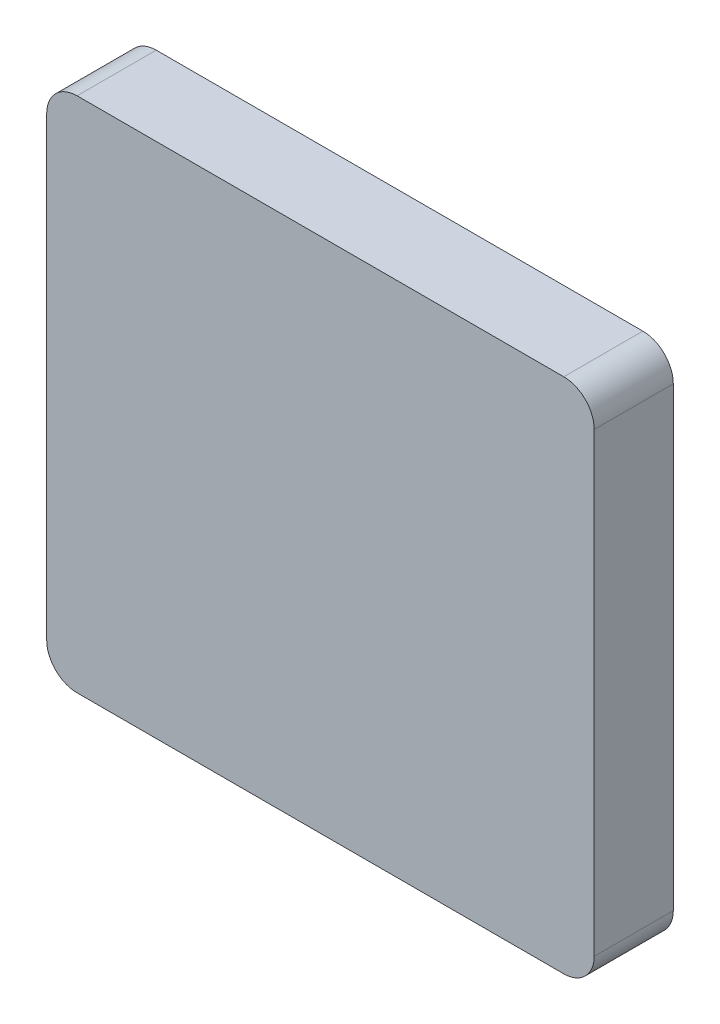
ISO-10303-21;
HEADER;
FILE_DESCRIPTION(('STEP AP214'),'2;1');
FILE_NAME('part.step','',(''),(''),'','','');
FILE_SCHEMA(('AUTOMOTIVE_DESIGN { 1 0 10303 214 1 1 1 1 }'));
ENDSEC;
DATA;
#1=APPLICATION_CONTEXT('core data for automotive mechanical design processes');
#2=APPLICATION_PROTOCOL_DEFINITION('international standard','automotive_design',2000,#1);
#3=PRODUCT_CONTEXT('',#1,'mechanical');
#4=PRODUCT('Part','Part','',(#3));
#5=PRODUCT_RELATED_PRODUCT_CATEGORY('part','',(#4));
#6=PRODUCT_DEFINITION_FORMATION('','',#4);
#7=PRODUCT_DEFINITION_CONTEXT('part definition',#1,'design');
#8=PRODUCT_DEFINITION('design','',#6,#7);
#9=PRODUCT_DEFINITION_SHAPE('','',#8);
#10=(LENGTH_UNIT() NAMED_UNIT(*) SI_UNIT(.MILLI.,.METRE.));
#11=(NAMED_UNIT(*) PLANE_ANGLE_UNIT() SI_UNIT($,.RADIAN.));
#12=(NAMED_UNIT(*) SI_UNIT($,.STERADIAN.) SOLID_ANGLE_UNIT());
#13=UNCERTAINTY_MEASURE_WITH_UNIT(LENGTH_MEASURE(1.E-05),#10,'distance_accuracy_value','');
#14=(GEOMETRIC_REPRESENTATION_CONTEXT(3) GLOBAL_UNCERTAINTY_ASSIGNED_CONTEXT((#13)) GLOBAL_UNIT_ASSIGNED_CONTEXT((#10,
#11,#12)) REPRESENTATION_CONTEXT('',''));
#15=CARTESIAN_POINT('',(0.,0.,0.));
#16=DIRECTION('',(0.,0.,1.));
#17=DIRECTION('',(1.,0.,0.));
#18=AXIS2_PLACEMENT_3D('',#15,#16,#17);
#19=CARTESIAN_POINT('',(-9.,8.5,2.6));
#20=DIRECTION('',(1.,0.,0.));
#21=DIRECTION('',(0.,1.,0.));
#22=AXIS2_PLACEMENT_3D('',#19,#20,#21);
#23=PLANE('',#22);
#24=DIRECTION('',(0.,-1.,0.));
#25=VECTOR('',#24,1.);
#26=CARTESIAN_POINT('',(-9.,8.5,0.));
#27=LINE('',#26,#25);
#28=CARTESIAN_POINT('',(-9.,7.5,0.));
#29=VERTEX_POINT('',#28);
#30=CARTESIAN_POINT('',(-9.,-7.5,0.));
#31=VERTEX_POINT('',#30);
#32=EDGE_CURVE('E131',#29,#31,#27,.T.);
#33=ORIENTED_EDGE('',*,*,#32,.T.);
#34=DIRECTION('',(0.,0.,-1.));
#35=VECTOR('',#34,1.);
#36=CARTESIAN_POINT('',(-9.,-7.5,2.6));
#37=LINE('',#36,#35);
#38=CARTESIAN_POINT('',(-9.,-7.5,2.6));
#39=VERTEX_POINT('',#38);
#40=EDGE_CURVE('E109',#31,#39,#37,.F.);
#41=ORIENTED_EDGE('',*,*,#40,.T.);
#42=DIRECTION('',(0.,-1.,0.));
#43=VECTOR('',#42,1.);
#44=CARTESIAN_POINT('',(-9.,8.5,2.6));
#45=LINE('',#44,#43);
#46=CARTESIAN_POINT('',(-9.,7.5,2.6));
#47=VERTEX_POINT('',#46);
#48=EDGE_CURVE('E143',#47,#39,#45,.T.);
#49=ORIENTED_EDGE('',*,*,#48,.F.);
#50=DIRECTION('',(0.,0.,-1.));
#51=VECTOR('',#50,1.);
#52=CARTESIAN_POINT('',(-9.,7.5,2.6));
#53=LINE('',#52,#51);
#54=EDGE_CURVE('E113',#47,#29,#53,.T.);
#55=ORIENTED_EDGE('',*,*,#54,.T.);
#56=EDGE_LOOP('',(#33,#41,#49,#55));
#57=FACE_BOUND('',#56,.T.);
#58=ADVANCED_FACE('F39',(#57),#23,.F.);
#59=CARTESIAN_POINT('',(9.,-8.5,2.6));
#60=DIRECTION('',(0.,1.,0.));
#61=DIRECTION('',(-1.,0.,0.));
#62=AXIS2_PLACEMENT_3D('',#59,#60,#61);
#63=PLANE('',#62);
#64=DIRECTION('',(1.,0.,0.));
#65=VECTOR('',#64,1.);
#66=CARTESIAN_POINT('',(9.,-8.5,2.6));
#67=LINE('',#66,#65);
#68=CARTESIAN_POINT('',(-8.,-8.5,2.6));
#69=VERTEX_POINT('',#68);
#70=CARTESIAN_POINT('',(8.,-8.5,2.6));
#71=VERTEX_POINT('',#70);
#72=EDGE_CURVE('E122',#69,#71,#67,.T.);
#73=ORIENTED_EDGE('',*,*,#72,.F.);
#74=DIRECTION('',(0.,0.,-1.));
#75=VECTOR('',#74,1.);
#76=CARTESIAN_POINT('',(-8.,-8.5,2.6));
#77=LINE('',#76,#75);
#78=CARTESIAN_POINT('',(-8.,-8.5,0.));
#79=VERTEX_POINT('',#78);
#80=EDGE_CURVE('E108',#69,#79,#77,.T.);
#81=ORIENTED_EDGE('',*,*,#80,.T.);
#82=DIRECTION('',(1.,0.,0.));
#83=VECTOR('',#82,1.);
#84=CARTESIAN_POINT('',(9.,-8.5,0.));
#85=LINE('',#84,#83);
#86=CARTESIAN_POINT('',(8.,-8.5,0.));
#87=VERTEX_POINT('',#86);
#88=EDGE_CURVE('E125',#79,#87,#85,.T.);
#89=ORIENTED_EDGE('',*,*,#88,.T.);
#90=DIRECTION('',(0.,0.,-1.));
#91=VECTOR('',#90,1.);
#92=CARTESIAN_POINT('',(8.,-8.5,2.6));
#93=LINE('',#92,#91);
#94=EDGE_CURVE('E130',#87,#71,#93,.F.);
#95=ORIENTED_EDGE('',*,*,#94,.T.);
#96=EDGE_LOOP('',(#73,#81,#89,#95));
#97=FACE_BOUND('',#96,.T.);
#98=ADVANCED_FACE('F123',(#97),#63,.F.);
#99=CARTESIAN_POINT('',(9.,8.5,2.6));
#100=DIRECTION('',(-1.,0.,0.));
#101=DIRECTION('',(0.,0.,1.));
#102=AXIS2_PLACEMENT_3D('',#99,#100,#101);
#103=PLANE('',#102);
#104=DIRECTION('',(0.,1.,0.));
#105=VECTOR('',#104,1.);
#106=CARTESIAN_POINT('',(9.,8.5,2.6));
#107=LINE('',#106,#105);
#108=CARTESIAN_POINT('',(9.,-7.5,2.6));
#109=VERTEX_POINT('',#108);
#110=CARTESIAN_POINT('',(9.,7.5,2.6));
#111=VERTEX_POINT('',#110);
#112=EDGE_CURVE('E170',#109,#111,#107,.T.);
#113=ORIENTED_EDGE('',*,*,#112,.F.);
#114=DIRECTION('',(0.,0.,-1.));
#115=VECTOR('',#114,1.);
#116=CARTESIAN_POINT('',(9.,-7.5,2.6));
#117=LINE('',#116,#115);
#118=CARTESIAN_POINT('',(9.,-7.5,0.));
#119=VERTEX_POINT('',#118);
#120=EDGE_CURVE('E159',#109,#119,#117,.T.);
#121=ORIENTED_EDGE('',*,*,#120,.T.);
#122=DIRECTION('',(0.,1.,0.));
#123=VECTOR('',#122,1.);
#124=CARTESIAN_POINT('',(9.,8.5,0.));
#125=LINE('',#124,#123);
#126=CARTESIAN_POINT('',(9.,7.5,0.));
#127=VERTEX_POINT('',#126);
#128=EDGE_CURVE('E134',#119,#127,#125,.T.);
#129=ORIENTED_EDGE('',*,*,#128,.T.);
#130=DIRECTION('',(0.,0.,-1.));
#131=VECTOR('',#130,1.);
#132=CARTESIAN_POINT('',(9.,7.5,2.6));
#133=LINE('',#132,#131);
#134=EDGE_CURVE('E158',#127,#111,#133,.F.);
#135=ORIENTED_EDGE('',*,*,#134,.T.);
#136=EDGE_LOOP('',(#113,#121,#129,#135));
#137=FACE_BOUND('',#136,.T.);
#138=ADVANCED_FACE('F164',(#137),#103,.F.);
#139=CARTESIAN_POINT('',(9.,8.5,2.6));
#140=DIRECTION('',(0.,-1.,0.));
#141=DIRECTION('',(1.,0.,0.));
#142=AXIS2_PLACEMENT_3D('',#139,#140,#141);
#143=PLANE('',#142);
#144=DIRECTION('',(-1.,0.,0.));
#145=VECTOR('',#144,1.);
#146=CARTESIAN_POINT('',(9.,8.5,2.6));
#147=LINE('',#146,#145);
#148=CARTESIAN_POINT('',(8.,8.5,2.6));
#149=VERTEX_POINT('',#148);
#150=CARTESIAN_POINT('',(-8.,8.5,2.6));
#151=VERTEX_POINT('',#150);
#152=EDGE_CURVE('E142',#149,#151,#147,.T.);
#153=ORIENTED_EDGE('',*,*,#152,.F.);
#154=DIRECTION('',(0.,0.,-1.));
#155=VECTOR('',#154,1.);
#156=CARTESIAN_POINT('',(8.,8.5,2.6));
#157=LINE('',#156,#155);
#158=CARTESIAN_POINT('',(8.,8.5,0.));
#159=VERTEX_POINT('',#158);
#160=EDGE_CURVE('E11',#149,#159,#157,.T.);
#161=ORIENTED_EDGE('',*,*,#160,.T.);
#162=DIRECTION('',(-1.,0.,0.));
#163=VECTOR('',#162,1.);
#164=CARTESIAN_POINT('',(9.,8.5,0.));
#165=LINE('',#164,#163);
#166=CARTESIAN_POINT('',(-8.,8.5,0.));
#167=VERTEX_POINT('',#166);
#168=EDGE_CURVE('E132',#159,#167,#165,.T.);
#169=ORIENTED_EDGE('',*,*,#168,.T.);
#170=DIRECTION('',(0.,0.,-1.));
#171=VECTOR('',#170,1.);
#172=CARTESIAN_POINT('',(-8.,8.5,2.6));
#173=LINE('',#172,#171);
#174=EDGE_CURVE('E50',#167,#151,#173,.F.);
#175=ORIENTED_EDGE('',*,*,#174,.T.);
#176=EDGE_LOOP('',(#153,#161,#169,#175));
#177=FACE_BOUND('',#176,.T.);
#178=ADVANCED_FACE('F173',(#177),#143,.F.);
#179=CARTESIAN_POINT('',(0.,0.,2.6));
#180=DIRECTION('',(0.,0.,-1.));
#181=DIRECTION('',(-1.,0.,0.));
#182=AXIS2_PLACEMENT_3D('',#179,#180,#181);
#183=PLANE('',#182);
#184=ORIENTED_EDGE('',*,*,#48,.T.);
#185=CARTESIAN_POINT('',(-8.,-7.5,2.6));
#186=DIRECTION('',(0.,0.,-1.));
#187=DIRECTION('',(-1.,0.,0.));
#188=AXIS2_PLACEMENT_3D('',#185,#186,#187);
#189=CIRCLE('',#188,1.);
#190=EDGE_CURVE('E156',#39,#69,#189,.F.);
#191=ORIENTED_EDGE('',*,*,#190,.T.);
#192=ORIENTED_EDGE('',*,*,#72,.T.);
#193=CARTESIAN_POINT('',(8.,-7.5,2.6));
#194=DIRECTION('',(0.,0.,-1.));
#195=DIRECTION('',(-1.,0.,0.));
#196=AXIS2_PLACEMENT_3D('',#193,#194,#195);
#197=CIRCLE('',#196,1.);
#198=EDGE_CURVE('E152',#71,#109,#197,.F.);
#199=ORIENTED_EDGE('',*,*,#198,.T.);
#200=ORIENTED_EDGE('',*,*,#112,.T.);
#201=CARTESIAN_POINT('',(8.,7.5,2.6));
#202=DIRECTION('',(0.,0.,-1.));
#203=DIRECTION('',(-1.,0.,0.));
#204=AXIS2_PLACEMENT_3D('',#201,#202,#203);
#205=CIRCLE('',#204,1.);
#206=EDGE_CURVE('E58',#111,#149,#205,.F.);
#207=ORIENTED_EDGE('',*,*,#206,.T.);
#208=ORIENTED_EDGE('',*,*,#152,.T.);
#209=CARTESIAN_POINT('',(-8.,7.5,2.6));
#210=DIRECTION('',(0.,0.,-1.));
#211=DIRECTION('',(-1.,0.,0.));
#212=AXIS2_PLACEMENT_3D('',#209,#210,#211);
#213=CIRCLE('',#212,1.);
#214=EDGE_CURVE('E151',#151,#47,#213,.F.);
#215=ORIENTED_EDGE('',*,*,#214,.T.);
#216=EDGE_LOOP('',(#184,#191,#192,#199,#200,#207,#208,#215));
#217=FACE_BOUND('',#216,.T.);
#218=ADVANCED_FACE('F182',(#217),#183,.F.);
#219=CARTESIAN_POINT('',(0.,0.,0.));
#220=DIRECTION('',(0.,0.,-1.));
#221=DIRECTION('',(-1.,0.,0.));
#222=AXIS2_PLACEMENT_3D('',#219,#220,#221);
#223=PLANE('',#222);
#224=ORIENTED_EDGE('',*,*,#88,.F.);
#225=CARTESIAN_POINT('',(-8.,-7.5,0.));
#226=DIRECTION('',(0.,0.,-1.));
#227=DIRECTION('',(-1.,0.,0.));
#228=AXIS2_PLACEMENT_3D('',#225,#226,#227);
#229=CIRCLE('',#228,1.);
#230=EDGE_CURVE('E104',#79,#31,#229,.T.);
#231=ORIENTED_EDGE('',*,*,#230,.T.);
#232=ORIENTED_EDGE('',*,*,#32,.F.);
#233=CARTESIAN_POINT('',(-8.,7.5,0.));
#234=DIRECTION('',(0.,0.,-1.));
#235=DIRECTION('',(-1.,0.,0.));
#236=AXIS2_PLACEMENT_3D('',#233,#234,#235);
#237=CIRCLE('',#236,1.);
#238=EDGE_CURVE('E127',#29,#167,#237,.T.);
#239=ORIENTED_EDGE('',*,*,#238,.T.);
#240=ORIENTED_EDGE('',*,*,#168,.F.);
#241=CARTESIAN_POINT('',(8.,7.5,0.));
#242=DIRECTION('',(0.,0.,-1.));
#243=DIRECTION('',(-1.,0.,0.));
#244=AXIS2_PLACEMENT_3D('',#241,#242,#243);
#245=CIRCLE('',#244,1.);
#246=EDGE_CURVE('E144',#159,#127,#245,.T.);
#247=ORIENTED_EDGE('',*,*,#246,.T.);
#248=ORIENTED_EDGE('',*,*,#128,.F.);
#249=CARTESIAN_POINT('',(8.,-7.5,0.));
#250=DIRECTION('',(0.,0.,-1.));
#251=DIRECTION('',(-1.,0.,0.));
#252=AXIS2_PLACEMENT_3D('',#249,#250,#251);
#253=CIRCLE('',#252,1.);
#254=EDGE_CURVE('E119',#119,#87,#253,.T.);
#255=ORIENTED_EDGE('',*,*,#254,.T.);
#256=EDGE_LOOP('',(#224,#231,#232,#239,#240,#247,#248,#255));
#257=FACE_BOUND('',#256,.T.);
#258=ADVANCED_FACE('F129',(#257),#223,.T.);
#259=CARTESIAN_POINT('',(-8.,-7.5,2.6));
#260=DIRECTION('',(0.,0.,-1.));
#261=DIRECTION('',(-1.,0.,0.));
#262=AXIS2_PLACEMENT_3D('',#259,#260,#261);
#263=CYLINDRICAL_SURFACE('',#262,1.);
#264=ORIENTED_EDGE('',*,*,#190,.F.);
#265=ORIENTED_EDGE('',*,*,#40,.F.);
#266=ORIENTED_EDGE('',*,*,#230,.F.);
#267=ORIENTED_EDGE('',*,*,#80,.F.);
#268=EDGE_LOOP('',(#264,#265,#266,#267));
#269=FACE_BOUND('',#268,.T.);
#270=ADVANCED_FACE('F107',(#269),#263,.T.);
#271=CARTESIAN_POINT('',(8.,-7.5,2.6));
#272=DIRECTION('',(0.,0.,-1.));
#273=DIRECTION('',(-1.,0.,0.));
#274=AXIS2_PLACEMENT_3D('',#271,#272,#273);
#275=CYLINDRICAL_SURFACE('',#274,1.);
#276=ORIENTED_EDGE('',*,*,#198,.F.);
#277=ORIENTED_EDGE('',*,*,#94,.F.);
#278=ORIENTED_EDGE('',*,*,#254,.F.);
#279=ORIENTED_EDGE('',*,*,#120,.F.);
#280=EDGE_LOOP('',(#276,#277,#278,#279));
#281=FACE_BOUND('',#280,.T.);
#282=ADVANCED_FACE('F188',(#281),#275,.T.);
#283=CARTESIAN_POINT('',(8.,7.5,2.6));
#284=DIRECTION('',(0.,0.,-1.));
#285=DIRECTION('',(-1.,0.,0.));
#286=AXIS2_PLACEMENT_3D('',#283,#284,#285);
#287=CYLINDRICAL_SURFACE('',#286,1.);
#288=ORIENTED_EDGE('',*,*,#206,.F.);
#289=ORIENTED_EDGE('',*,*,#134,.F.);
#290=ORIENTED_EDGE('',*,*,#246,.F.);
#291=ORIENTED_EDGE('',*,*,#160,.F.);
#292=EDGE_LOOP('',(#288,#289,#290,#291));
#293=FACE_BOUND('',#292,.T.);
#294=ADVANCED_FACE('F175',(#293),#287,.T.);
#295=CARTESIAN_POINT('',(-8.,7.5,2.6));
#296=DIRECTION('',(0.,0.,-1.));
#297=DIRECTION('',(-1.,0.,0.));
#298=AXIS2_PLACEMENT_3D('',#295,#296,#297);
#299=CYLINDRICAL_SURFACE('',#298,1.);
#300=ORIENTED_EDGE('',*,*,#214,.F.);
#301=ORIENTED_EDGE('',*,*,#174,.F.);
#302=ORIENTED_EDGE('',*,*,#238,.F.);
#303=ORIENTED_EDGE('',*,*,#54,.F.);
#304=EDGE_LOOP('',(#300,#301,#302,#303));
#305=FACE_BOUND('',#304,.T.);
#306=ADVANCED_FACE('F41',(#305),#299,.T.);
#307=CLOSED_SHELL('',(#58,#98,#138,#178,#218,#258,#270,#282,#294,#306));
#308=MANIFOLD_SOLID_BREP('B2',#307);
#309=ADVANCED_BREP_SHAPE_REPRESENTATION('',(#18,#308),#14);
#310=SHAPE_DEFINITION_REPRESENTATION(#9,#309);
ENDSEC;
END-ISO-10303-21;
